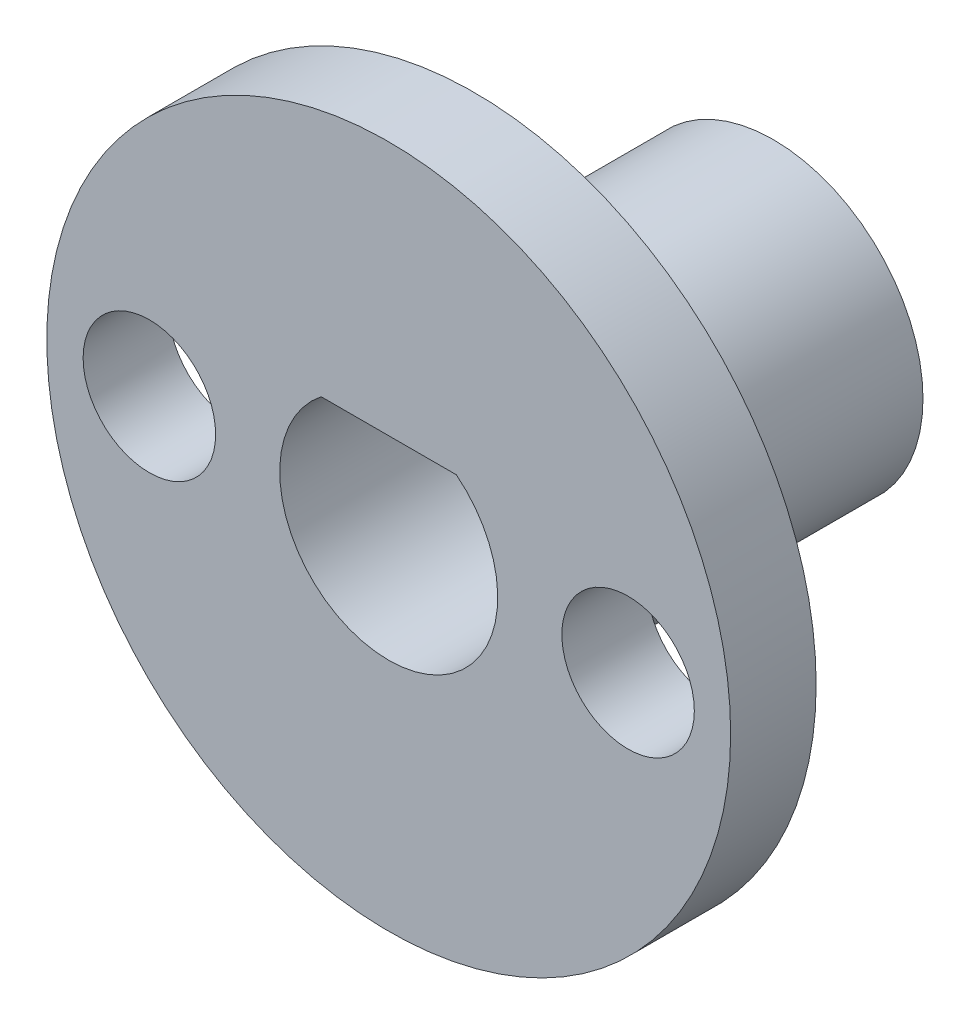
ISO-10303-21;
HEADER;
FILE_DESCRIPTION(('STEP AP214'),'2;1');
FILE_NAME('part.step','',(''),(''),'','','');
FILE_SCHEMA(('AUTOMOTIVE_DESIGN { 1 0 10303 214 1 1 1 1 }'));
ENDSEC;
DATA;
#1=APPLICATION_CONTEXT('core data for automotive mechanical design processes');
#2=APPLICATION_PROTOCOL_DEFINITION('international standard','automotive_design',2000,#1);
#3=PRODUCT_CONTEXT('',#1,'mechanical');
#4=PRODUCT('Part','Part','',(#3));
#5=PRODUCT_RELATED_PRODUCT_CATEGORY('part','',(#4));
#6=PRODUCT_DEFINITION_FORMATION('','',#4);
#7=PRODUCT_DEFINITION_CONTEXT('part definition',#1,'design');
#8=PRODUCT_DEFINITION('design','',#6,#7);
#9=PRODUCT_DEFINITION_SHAPE('','',#8);
#10=(LENGTH_UNIT() NAMED_UNIT(*) SI_UNIT(.MILLI.,.METRE.));
#11=(NAMED_UNIT(*) PLANE_ANGLE_UNIT() SI_UNIT($,.RADIAN.));
#12=(NAMED_UNIT(*) SI_UNIT($,.STERADIAN.) SOLID_ANGLE_UNIT());
#13=UNCERTAINTY_MEASURE_WITH_UNIT(LENGTH_MEASURE(1.E-05),#10,'distance_accuracy_value','');
#14=(GEOMETRIC_REPRESENTATION_CONTEXT(3) GLOBAL_UNCERTAINTY_ASSIGNED_CONTEXT((#13)) GLOBAL_UNIT_ASSIGNED_CONTEXT((#10,
#11,#12)) REPRESENTATION_CONTEXT('',''));
#15=CARTESIAN_POINT('',(0.,0.,0.));
#16=DIRECTION('',(0.,0.,1.));
#17=DIRECTION('',(1.,0.,0.));
#18=AXIS2_PLACEMENT_3D('',#15,#16,#17);
#19=CARTESIAN_POINT('',(0.,0.,-3.));
#20=DIRECTION('',(0.,0.,1.));
#21=DIRECTION('',(1.,0.,0.));
#22=AXIS2_PLACEMENT_3D('',#19,#20,#21);
#23=CYLINDRICAL_SURFACE('',#22,3.5);
#24=CARTESIAN_POINT('',(0.,0.,-3.));
#25=DIRECTION('',(0.,0.,1.));
#26=DIRECTION('',(1.,0.,0.));
#27=AXIS2_PLACEMENT_3D('',#24,#25,#26);
#28=CIRCLE('',#27,3.5);
#29=CARTESIAN_POINT('',(3.5,0.,-3.));
#30=VERTEX_POINT('',#29);
#31=EDGE_CURVE('E11',#30,#30,#28,.T.);
#32=ORIENTED_EDGE('',*,*,#31,.T.);
#33=EDGE_LOOP('',(#32));
#34=FACE_BOUND('',#33,.T.);
#35=CARTESIAN_POINT('',(0.,0.,4.));
#36=DIRECTION('',(0.,0.,1.));
#37=DIRECTION('',(1.,0.,0.));
#38=AXIS2_PLACEMENT_3D('',#35,#36,#37);
#39=CIRCLE('',#38,3.5);
#40=CARTESIAN_POINT('',(3.5,0.,4.));
#41=VERTEX_POINT('',#40);
#42=EDGE_CURVE('E67',#41,#41,#39,.F.);
#43=ORIENTED_EDGE('',*,*,#42,.T.);
#44=EDGE_LOOP('',(#43));
#45=FACE_BOUND('',#44,.T.);
#46=ADVANCED_FACE('F35',(#34,#45),#23,.T.);
#47=CARTESIAN_POINT('',(0.,0.,6.));
#48=DIRECTION('',(0.,0.,-1.));
#49=DIRECTION('',(-1.,0.,0.));
#50=AXIS2_PLACEMENT_3D('',#47,#48,#49);
#51=CYLINDRICAL_SURFACE('',#50,2.55);
#52=DIRECTION('',(0.,0.,-1.));
#53=VECTOR('',#52,1.);
#54=CARTESIAN_POINT('',(-1.58192920195564,2.,6.));
#55=LINE('',#54,#53);
#56=CARTESIAN_POINT('',(-1.58192920195564,2.,6.));
#57=VERTEX_POINT('',#56);
#58=CARTESIAN_POINT('',(-1.58192920195564,2.,-3.));
#59=VERTEX_POINT('',#58);
#60=EDGE_CURVE('E55',#57,#59,#55,.T.);
#61=ORIENTED_EDGE('',*,*,#60,.F.);
#62=CARTESIAN_POINT('',(0.,0.,6.));
#63=DIRECTION('',(0.,0.,1.));
#64=DIRECTION('',(1.,0.,0.));
#65=AXIS2_PLACEMENT_3D('',#62,#63,#64);
#66=CIRCLE('',#65,2.55);
#67=CARTESIAN_POINT('',(1.58192920195564,2.,6.));
#68=VERTEX_POINT('',#67);
#69=EDGE_CURVE('E63',#57,#68,#66,.T.);
#70=ORIENTED_EDGE('',*,*,#69,.T.);
#71=DIRECTION('',(0.,0.,-1.));
#72=VECTOR('',#71,1.);
#73=CARTESIAN_POINT('',(1.58192920195564,2.,6.));
#74=LINE('',#73,#72);
#75=CARTESIAN_POINT('',(1.58192920195564,2.,-3.));
#76=VERTEX_POINT('',#75);
#77=EDGE_CURVE('E50',#68,#76,#74,.T.);
#78=ORIENTED_EDGE('',*,*,#77,.T.);
#79=CARTESIAN_POINT('',(0.,0.,-3.));
#80=DIRECTION('',(0.,0.,-1.));
#81=DIRECTION('',(-1.,0.,0.));
#82=AXIS2_PLACEMENT_3D('',#79,#80,#81);
#83=CIRCLE('',#82,2.55);
#84=EDGE_CURVE('E38',#76,#59,#83,.T.);
#85=ORIENTED_EDGE('',*,*,#84,.T.);
#86=EDGE_LOOP('',(#61,#70,#78,#85));
#87=FACE_BOUND('',#86,.T.);
#88=ADVANCED_FACE('F61',(#87),#51,.F.);
#89=CARTESIAN_POINT('',(-1.58192920195564,2.,6.));
#90=DIRECTION('',(0.,1.,0.));
#91=DIRECTION('',(-1.,0.,0.));
#92=AXIS2_PLACEMENT_3D('',#89,#90,#91);
#93=PLANE('',#92);
#94=ORIENTED_EDGE('',*,*,#77,.F.);
#95=DIRECTION('',(-1.,0.,0.));
#96=VECTOR('',#95,1.);
#97=CARTESIAN_POINT('',(-1.58192920195564,2.,6.));
#98=LINE('',#97,#96);
#99=EDGE_CURVE('E69',#68,#57,#98,.T.);
#100=ORIENTED_EDGE('',*,*,#99,.T.);
#101=ORIENTED_EDGE('',*,*,#60,.T.);
#102=DIRECTION('',(-1.,0.,0.));
#103=VECTOR('',#102,1.);
#104=CARTESIAN_POINT('',(-1.58192920195564,2.,-3.));
#105=LINE('',#104,#103);
#106=EDGE_CURVE('E90',#59,#76,#105,.F.);
#107=ORIENTED_EDGE('',*,*,#106,.T.);
#108=EDGE_LOOP('',(#94,#100,#101,#107));
#109=FACE_BOUND('',#108,.T.);
#110=ADVANCED_FACE('F70',(#109),#93,.F.);
#111=CARTESIAN_POINT('',(0.,0.,-3.));
#112=DIRECTION('',(0.,0.,1.));
#113=DIRECTION('',(1.,0.,0.));
#114=AXIS2_PLACEMENT_3D('',#111,#112,#113);
#115=PLANE('',#114);
#116=ORIENTED_EDGE('',*,*,#106,.F.);
#117=ORIENTED_EDGE('',*,*,#84,.F.);
#118=EDGE_LOOP('',(#116,#117));
#119=FACE_BOUND('',#118,.T.);
#120=ORIENTED_EDGE('',*,*,#31,.F.);
#121=EDGE_LOOP('',(#120));
#122=FACE_BOUND('',#121,.T.);
#123=ADVANCED_FACE('F92',(#119,#122),#115,.F.);
#124=CARTESIAN_POINT('',(0.,-0.0432357206800224,4.));
#125=DIRECTION('',(0.,0.,1.));
#126=DIRECTION('',(1.,0.,0.));
#127=AXIS2_PLACEMENT_3D('',#124,#125,#126);
#128=CYLINDRICAL_SURFACE('',#127,8.);
#129=CARTESIAN_POINT('',(0.,-0.0432357206800224,4.));
#130=DIRECTION('',(0.,0.,1.));
#131=DIRECTION('',(1.,0.,0.));
#132=AXIS2_PLACEMENT_3D('',#129,#130,#131);
#133=CIRCLE('',#132,8.);
#134=CARTESIAN_POINT('',(8.,-0.0432357206800224,4.));
#135=VERTEX_POINT('',#134);
#136=EDGE_CURVE('E83',#135,#135,#133,.T.);
#137=ORIENTED_EDGE('',*,*,#136,.T.);
#138=EDGE_LOOP('',(#137));
#139=FACE_BOUND('',#138,.T.);
#140=CARTESIAN_POINT('',(0.,-0.0432357206800224,6.));
#141=DIRECTION('',(0.,0.,1.));
#142=DIRECTION('',(1.,0.,0.));
#143=AXIS2_PLACEMENT_3D('',#140,#141,#142);
#144=CIRCLE('',#143,8.);
#145=CARTESIAN_POINT('',(8.,-0.0432357206800224,6.));
#146=VERTEX_POINT('',#145);
#147=EDGE_CURVE('E72',#146,#146,#144,.T.);
#148=ORIENTED_EDGE('',*,*,#147,.F.);
#149=EDGE_LOOP('',(#148));
#150=FACE_BOUND('',#149,.T.);
#151=ADVANCED_FACE('F95',(#139,#150),#128,.T.);
#152=CARTESIAN_POINT('',(0.,-0.0432357206800224,4.));
#153=DIRECTION('',(0.,0.,1.));
#154=DIRECTION('',(1.,0.,0.));
#155=AXIS2_PLACEMENT_3D('',#152,#153,#154);
#156=PLANE('',#155);
#157=CARTESIAN_POINT('',(5.6,0.,4.));
#158=DIRECTION('',(0.,0.,1.));
#159=DIRECTION('',(1.,0.,0.));
#160=AXIS2_PLACEMENT_3D('',#157,#158,#159);
#161=CIRCLE('',#160,1.55);
#162=CARTESIAN_POINT('',(7.15,0.,4.));
#163=VERTEX_POINT('',#162);
#164=EDGE_CURVE('E76',#163,#163,#161,.T.);
#165=ORIENTED_EDGE('',*,*,#164,.T.);
#166=EDGE_LOOP('',(#165));
#167=FACE_BOUND('',#166,.T.);
#168=CARTESIAN_POINT('',(-5.6,0.,4.));
#169=DIRECTION('',(0.,0.,1.));
#170=DIRECTION('',(1.,0.,0.));
#171=AXIS2_PLACEMENT_3D('',#168,#169,#170);
#172=CIRCLE('',#171,1.55);
#173=CARTESIAN_POINT('',(-4.05,0.,4.));
#174=VERTEX_POINT('',#173);
#175=EDGE_CURVE('E79',#174,#174,#172,.T.);
#176=ORIENTED_EDGE('',*,*,#175,.T.);
#177=EDGE_LOOP('',(#176));
#178=FACE_BOUND('',#177,.T.);
#179=ORIENTED_EDGE('',*,*,#42,.F.);
#180=EDGE_LOOP('',(#179));
#181=FACE_BOUND('',#180,.T.);
#182=ORIENTED_EDGE('',*,*,#136,.F.);
#183=EDGE_LOOP('',(#182));
#184=FACE_BOUND('',#183,.T.);
#185=ADVANCED_FACE('F102',(#167,#178,#181,#184),#156,.F.);
#186=CARTESIAN_POINT('',(0.,0.,6.));
#187=DIRECTION('',(0.,0.,1.));
#188=DIRECTION('',(1.,0.,0.));
#189=AXIS2_PLACEMENT_3D('',#186,#187,#188);
#190=PLANE('',#189);
#191=CARTESIAN_POINT('',(5.6,0.,6.));
#192=DIRECTION('',(0.,0.,1.));
#193=DIRECTION('',(1.,0.,0.));
#194=AXIS2_PLACEMENT_3D('',#191,#192,#193);
#195=CIRCLE('',#194,1.55);
#196=CARTESIAN_POINT('',(7.15,0.,6.));
#197=VERTEX_POINT('',#196);
#198=EDGE_CURVE('E136',#197,#197,#195,.T.);
#199=ORIENTED_EDGE('',*,*,#198,.F.);
#200=EDGE_LOOP('',(#199));
#201=FACE_BOUND('',#200,.T.);
#202=CARTESIAN_POINT('',(-5.6,0.,6.));
#203=DIRECTION('',(0.,0.,1.));
#204=DIRECTION('',(-1.,0.,0.));
#205=AXIS2_PLACEMENT_3D('',#202,#203,#204);
#206=CIRCLE('',#205,1.55);
#207=CARTESIAN_POINT('',(-7.15,0.,6.));
#208=VERTEX_POINT('',#207);
#209=EDGE_CURVE('E142',#208,#208,#206,.T.);
#210=ORIENTED_EDGE('',*,*,#209,.F.);
#211=EDGE_LOOP('',(#210));
#212=FACE_BOUND('',#211,.T.);
#213=ORIENTED_EDGE('',*,*,#69,.F.);
#214=ORIENTED_EDGE('',*,*,#99,.F.);
#215=EDGE_LOOP('',(#213,#214));
#216=FACE_BOUND('',#215,.T.);
#217=ORIENTED_EDGE('',*,*,#147,.T.);
#218=EDGE_LOOP('',(#217));
#219=FACE_BOUND('',#218,.T.);
#220=ADVANCED_FACE('F74',(#201,#212,#216,#219),#190,.T.);
#221=CARTESIAN_POINT('',(-5.6,0.,3.5));
#222=DIRECTION('',(0.,0.,1.));
#223=DIRECTION('',(1.,0.,0.));
#224=AXIS2_PLACEMENT_3D('',#221,#222,#223);
#225=CYLINDRICAL_SURFACE('',#224,1.55);
#226=ORIENTED_EDGE('',*,*,#209,.T.);
#227=EDGE_LOOP('',(#226));
#228=FACE_BOUND('',#227,.T.);
#229=ORIENTED_EDGE('',*,*,#175,.F.);
#230=EDGE_LOOP('',(#229));
#231=FACE_BOUND('',#230,.T.);
#232=ADVANCED_FACE('F114',(#228,#231),#225,.F.);
#233=CARTESIAN_POINT('',(5.6,0.,3.5));
#234=DIRECTION('',(0.,0.,1.));
#235=DIRECTION('',(1.,0.,0.));
#236=AXIS2_PLACEMENT_3D('',#233,#234,#235);
#237=CYLINDRICAL_SURFACE('',#236,1.55);
#238=ORIENTED_EDGE('',*,*,#198,.T.);
#239=EDGE_LOOP('',(#238));
#240=FACE_BOUND('',#239,.T.);
#241=ORIENTED_EDGE('',*,*,#164,.F.);
#242=EDGE_LOOP('',(#241));
#243=FACE_BOUND('',#242,.T.);
#244=ADVANCED_FACE('F120',(#240,#243),#237,.F.);
#245=CLOSED_SHELL('',(#46,#88,#110,#123,#151,#185,#220,#232,#244));
#246=MANIFOLD_SOLID_BREP('B2',#245);
#247=ADVANCED_BREP_SHAPE_REPRESENTATION('',(#18,#246),#14);
#248=SHAPE_DEFINITION_REPRESENTATION(#9,#247);
ENDSEC;
END-ISO-10303-21;
